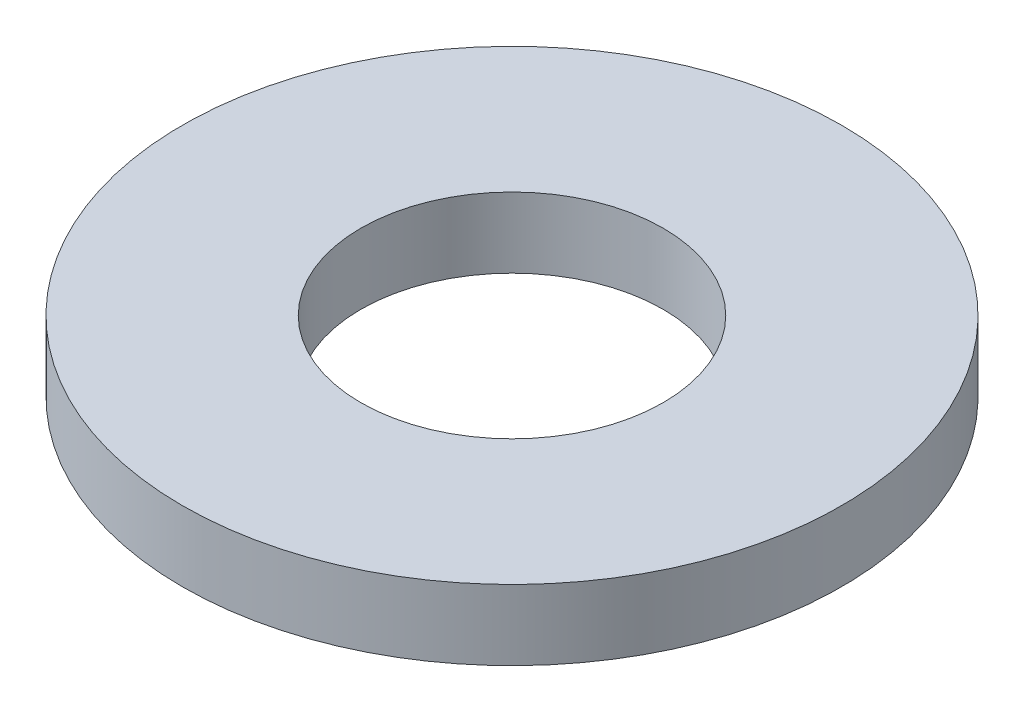
ISO-10303-21;
HEADER;
FILE_DESCRIPTION(('STEP AP214'),'2;1');
FILE_NAME('part.step','',(''),(''),'','','');
FILE_SCHEMA(('AUTOMOTIVE_DESIGN { 1 0 10303 214 1 1 1 1 }'));
ENDSEC;
DATA;
#1=APPLICATION_CONTEXT('core data for automotive mechanical design processes');
#2=APPLICATION_PROTOCOL_DEFINITION('international standard','automotive_design',2000,#1);
#3=PRODUCT_CONTEXT('',#1,'mechanical');
#4=PRODUCT('Part','Part','',(#3));
#5=PRODUCT_RELATED_PRODUCT_CATEGORY('part','',(#4));
#6=PRODUCT_DEFINITION_FORMATION('','',#4);
#7=PRODUCT_DEFINITION_CONTEXT('part definition',#1,'design');
#8=PRODUCT_DEFINITION('design','',#6,#7);
#9=PRODUCT_DEFINITION_SHAPE('','',#8);
#10=(LENGTH_UNIT() NAMED_UNIT(*) SI_UNIT(.MILLI.,.METRE.));
#11=(NAMED_UNIT(*) PLANE_ANGLE_UNIT() SI_UNIT($,.RADIAN.));
#12=(NAMED_UNIT(*) SI_UNIT($,.STERADIAN.) SOLID_ANGLE_UNIT());
#13=UNCERTAINTY_MEASURE_WITH_UNIT(LENGTH_MEASURE(1.E-05),#10,'distance_accuracy_value','');
#14=(GEOMETRIC_REPRESENTATION_CONTEXT(3) GLOBAL_UNCERTAINTY_ASSIGNED_CONTEXT((#13)) GLOBAL_UNIT_ASSIGNED_CONTEXT((#10,
#11,#12)) REPRESENTATION_CONTEXT('',''));
#15=CARTESIAN_POINT('',(0.,0.,0.));
#16=DIRECTION('',(0.,0.,1.));
#17=DIRECTION('',(1.,0.,0.));
#18=AXIS2_PLACEMENT_3D('',#15,#16,#17);
#19=CARTESIAN_POINT('',(0.,1.016,0.));
#20=DIRECTION('',(0.,-1.,0.));
#21=DIRECTION('',(0.,0.,-1.));
#22=AXIS2_PLACEMENT_3D('',#19,#20,#21);
#23=CYLINDRICAL_SURFACE('',#22,4.7625);
#24=CARTESIAN_POINT('',(0.,1.016,0.));
#25=DIRECTION('',(0.,1.,0.));
#26=DIRECTION('',(0.,0.,1.));
#27=AXIS2_PLACEMENT_3D('',#24,#25,#26);
#28=CIRCLE('',#27,4.7625);
#29=CARTESIAN_POINT('',(0.,1.016,4.7625));
#30=VERTEX_POINT('',#29);
#31=EDGE_CURVE('E10',#30,#30,#28,.T.);
#32=ORIENTED_EDGE('',*,*,#31,.F.);
#33=EDGE_LOOP('',(#32));
#34=FACE_BOUND('',#33,.T.);
#35=CARTESIAN_POINT('',(0.,0.,0.));
#36=DIRECTION('',(0.,1.,0.));
#37=DIRECTION('',(0.,0.,1.));
#38=AXIS2_PLACEMENT_3D('',#35,#36,#37);
#39=CIRCLE('',#38,4.7625);
#40=CARTESIAN_POINT('',(0.,0.,4.7625));
#41=VERTEX_POINT('',#40);
#42=EDGE_CURVE('E38',#41,#41,#39,.T.);
#43=ORIENTED_EDGE('',*,*,#42,.T.);
#44=EDGE_LOOP('',(#43));
#45=FACE_BOUND('',#44,.T.);
#46=ADVANCED_FACE('F35',(#34,#45),#23,.T.);
#47=CARTESIAN_POINT('',(0.,1.016,0.));
#48=DIRECTION('',(0.,1.,0.));
#49=DIRECTION('',(0.,0.,1.));
#50=AXIS2_PLACEMENT_3D('',#47,#48,#49);
#51=PLANE('',#50);
#52=CARTESIAN_POINT('',(0.,1.016,0.));
#53=DIRECTION('',(0.,1.,0.));
#54=DIRECTION('',(0.,0.,1.));
#55=AXIS2_PLACEMENT_3D('',#52,#53,#54);
#56=CIRCLE('',#55,2.1844);
#57=CARTESIAN_POINT('',(0.,1.016,2.1844));
#58=VERTEX_POINT('',#57);
#59=EDGE_CURVE('E47',#58,#58,#56,.T.);
#60=ORIENTED_EDGE('',*,*,#59,.F.);
#61=EDGE_LOOP('',(#60));
#62=FACE_BOUND('',#61,.T.);
#63=ORIENTED_EDGE('',*,*,#31,.T.);
#64=EDGE_LOOP('',(#63));
#65=FACE_BOUND('',#64,.T.);
#66=ADVANCED_FACE('F62',(#62,#65),#51,.T.);
#67=CARTESIAN_POINT('',(0.,0.,0.));
#68=DIRECTION('',(0.,1.,0.));
#69=DIRECTION('',(0.,0.,1.));
#70=AXIS2_PLACEMENT_3D('',#67,#68,#69);
#71=PLANE('',#70);
#72=CARTESIAN_POINT('',(0.,0.,0.));
#73=DIRECTION('',(0.,1.,0.));
#74=DIRECTION('',(0.,0.,1.));
#75=AXIS2_PLACEMENT_3D('',#72,#73,#74);
#76=CIRCLE('',#75,2.1844);
#77=CARTESIAN_POINT('',(0.,0.,2.1844));
#78=VERTEX_POINT('',#77);
#79=EDGE_CURVE('E45',#78,#78,#76,.T.);
#80=ORIENTED_EDGE('',*,*,#79,.T.);
#81=EDGE_LOOP('',(#80));
#82=FACE_BOUND('',#81,.T.);
#83=ORIENTED_EDGE('',*,*,#42,.F.);
#84=EDGE_LOOP('',(#83));
#85=FACE_BOUND('',#84,.T.);
#86=ADVANCED_FACE('F53',(#82,#85),#71,.F.);
#87=CARTESIAN_POINT('',(0.,0.,0.));
#88=DIRECTION('',(0.,1.,0.));
#89=DIRECTION('',(0.,0.,1.));
#90=AXIS2_PLACEMENT_3D('',#87,#88,#89);
#91=CYLINDRICAL_SURFACE('',#90,2.1844);
#92=ORIENTED_EDGE('',*,*,#79,.F.);
#93=EDGE_LOOP('',(#92));
#94=FACE_BOUND('',#93,.T.);
#95=ORIENTED_EDGE('',*,*,#59,.T.);
#96=EDGE_LOOP('',(#95));
#97=FACE_BOUND('',#96,.T.);
#98=ADVANCED_FACE('F56',(#94,#97),#91,.F.);
#99=CLOSED_SHELL('',(#46,#66,#86,#98));
#100=MANIFOLD_SOLID_BREP('B2',#99);
#101=ADVANCED_BREP_SHAPE_REPRESENTATION('',(#18,#100),#14);
#102=SHAPE_DEFINITION_REPRESENTATION(#9,#101);
ENDSEC;
END-ISO-10303-21;
